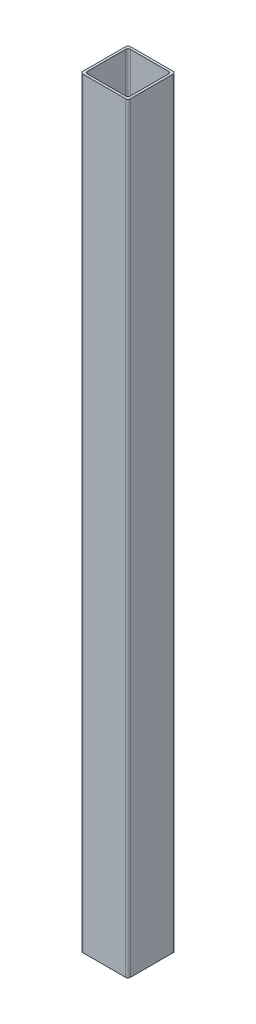
ISO-10303-21;
HEADER;
FILE_DESCRIPTION(('STEP AP214'),'2;1');
FILE_NAME('part.step','',(''),(''),'','','');
FILE_SCHEMA(('AUTOMOTIVE_DESIGN { 1 0 10303 214 1 1 1 1 }'));
ENDSEC;
DATA;
#1=APPLICATION_CONTEXT('core data for automotive mechanical design processes');
#2=APPLICATION_PROTOCOL_DEFINITION('international standard','automotive_design',2000,#1);
#3=PRODUCT_CONTEXT('',#1,'mechanical');
#4=PRODUCT('Part','Part','',(#3));
#5=PRODUCT_RELATED_PRODUCT_CATEGORY('part','',(#4));
#6=PRODUCT_DEFINITION_FORMATION('','',#4);
#7=PRODUCT_DEFINITION_CONTEXT('part definition',#1,'design');
#8=PRODUCT_DEFINITION('design','',#6,#7);
#9=PRODUCT_DEFINITION_SHAPE('','',#8);
#10=(LENGTH_UNIT() NAMED_UNIT(*) SI_UNIT(.MILLI.,.METRE.));
#11=(NAMED_UNIT(*) PLANE_ANGLE_UNIT() SI_UNIT($,.RADIAN.));
#12=(NAMED_UNIT(*) SI_UNIT($,.STERADIAN.) SOLID_ANGLE_UNIT());
#13=UNCERTAINTY_MEASURE_WITH_UNIT(LENGTH_MEASURE(1.E-05),#10,'distance_accuracy_value','');
#14=(GEOMETRIC_REPRESENTATION_CONTEXT(3) GLOBAL_UNCERTAINTY_ASSIGNED_CONTEXT((#13)) GLOBAL_UNIT_ASSIGNED_CONTEXT((#10,
#11,#12)) REPRESENTATION_CONTEXT('',''));
#15=CARTESIAN_POINT('',(0.,0.,0.));
#16=DIRECTION('',(0.,0.,1.));
#17=DIRECTION('',(1.,0.,0.));
#18=AXIS2_PLACEMENT_3D('',#15,#16,#17);
#19=CARTESIAN_POINT('',(18.,640.,-18.));
#20=DIRECTION('',(0.,1.,0.));
#21=DIRECTION('',(0.,0.,1.));
#22=AXIS2_PLACEMENT_3D('',#19,#20,#21);
#23=PLANE('',#22);
#24=CARTESIAN_POINT('',(18.,640.,-18.));
#25=DIRECTION('',(0.,1.,0.));
#26=DIRECTION('',(0.,0.,1.));
#27=AXIS2_PLACEMENT_3D('',#24,#25,#26);
#28=CIRCLE('',#27,2.);
#29=CARTESIAN_POINT('',(20.,640.,-18.));
#30=VERTEX_POINT('',#29);
#31=CARTESIAN_POINT('',(18.,640.,-20.));
#32=VERTEX_POINT('',#31);
#33=EDGE_CURVE('E213',#30,#32,#28,.T.);
#34=ORIENTED_EDGE('',*,*,#33,.T.);
#35=DIRECTION('',(-1.,0.,0.));
#36=VECTOR('',#35,1.);
#37=CARTESIAN_POINT('',(18.,640.,-20.));
#38=LINE('',#37,#36);
#39=CARTESIAN_POINT('',(-18.,640.,-20.));
#40=VERTEX_POINT('',#39);
#41=EDGE_CURVE('E216',#32,#40,#38,.T.);
#42=ORIENTED_EDGE('',*,*,#41,.T.);
#43=CARTESIAN_POINT('',(-18.,640.,-18.));
#44=DIRECTION('',(0.,1.,0.));
#45=DIRECTION('',(0.,0.,1.));
#46=AXIS2_PLACEMENT_3D('',#43,#44,#45);
#47=CIRCLE('',#46,2.);
#48=CARTESIAN_POINT('',(-20.,640.,-18.));
#49=VERTEX_POINT('',#48);
#50=EDGE_CURVE('E219',#40,#49,#47,.T.);
#51=ORIENTED_EDGE('',*,*,#50,.T.);
#52=DIRECTION('',(0.,0.,1.));
#53=VECTOR('',#52,1.);
#54=CARTESIAN_POINT('',(-20.,640.,18.));
#55=LINE('',#54,#53);
#56=CARTESIAN_POINT('',(-20.,640.,18.));
#57=VERTEX_POINT('',#56);
#58=EDGE_CURVE('E221',#49,#57,#55,.T.);
#59=ORIENTED_EDGE('',*,*,#58,.T.);
#60=CARTESIAN_POINT('',(-18.,640.,18.));
#61=DIRECTION('',(0.,1.,0.));
#62=DIRECTION('',(0.,0.,-1.));
#63=AXIS2_PLACEMENT_3D('',#60,#61,#62);
#64=CIRCLE('',#63,2.);
#65=CARTESIAN_POINT('',(-18.,640.,20.));
#66=VERTEX_POINT('',#65);
#67=EDGE_CURVE('E223',#57,#66,#64,.T.);
#68=ORIENTED_EDGE('',*,*,#67,.T.);
#69=DIRECTION('',(1.,0.,0.));
#70=VECTOR('',#69,1.);
#71=CARTESIAN_POINT('',(18.,640.,20.));
#72=LINE('',#71,#70);
#73=CARTESIAN_POINT('',(18.,640.,20.));
#74=VERTEX_POINT('',#73);
#75=EDGE_CURVE('E225',#66,#74,#72,.T.);
#76=ORIENTED_EDGE('',*,*,#75,.T.);
#77=CARTESIAN_POINT('',(18.,640.,18.));
#78=DIRECTION('',(0.,1.,0.));
#79=DIRECTION('',(0.,0.,1.));
#80=AXIS2_PLACEMENT_3D('',#77,#78,#79);
#81=CIRCLE('',#80,2.);
#82=CARTESIAN_POINT('',(20.,640.,18.));
#83=VERTEX_POINT('',#82);
#84=EDGE_CURVE('E227',#74,#83,#81,.T.);
#85=ORIENTED_EDGE('',*,*,#84,.T.);
#86=DIRECTION('',(0.,0.,-1.));
#87=VECTOR('',#86,1.);
#88=CARTESIAN_POINT('',(20.,640.,18.));
#89=LINE('',#88,#87);
#90=EDGE_CURVE('E229',#83,#30,#89,.T.);
#91=ORIENTED_EDGE('',*,*,#90,.T.);
#92=EDGE_LOOP('',(#34,#42,#51,#59,#68,#76,#85,#91));
#93=FACE_BOUND('',#92,.T.);
#94=DIRECTION('',(-1.,0.,0.));
#95=VECTOR('',#94,1.);
#96=CARTESIAN_POINT('',(16.,640.,-18.));
#97=LINE('',#96,#95);
#98=CARTESIAN_POINT('',(16.,640.,-18.));
#99=VERTEX_POINT('',#98);
#100=CARTESIAN_POINT('',(-16.,640.,-18.));
#101=VERTEX_POINT('',#100);
#102=EDGE_CURVE('E156',#99,#101,#97,.T.);
#103=ORIENTED_EDGE('',*,*,#102,.F.);
#104=CARTESIAN_POINT('',(16.,640.,-16.));
#105=DIRECTION('',(0.,1.,0.));
#106=DIRECTION('',(0.,0.,1.));
#107=AXIS2_PLACEMENT_3D('',#104,#105,#106);
#108=CIRCLE('',#107,2.);
#109=CARTESIAN_POINT('',(18.,640.,-16.));
#110=VERTEX_POINT('',#109);
#111=EDGE_CURVE('E148',#110,#99,#108,.T.);
#112=ORIENTED_EDGE('',*,*,#111,.F.);
#113=DIRECTION('',(0.,0.,-1.));
#114=VECTOR('',#113,1.);
#115=CARTESIAN_POINT('',(18.,640.,16.));
#116=LINE('',#115,#114);
#117=CARTESIAN_POINT('',(18.,640.,16.));
#118=VERTEX_POINT('',#117);
#119=EDGE_CURVE('E181',#118,#110,#116,.T.);
#120=ORIENTED_EDGE('',*,*,#119,.F.);
#121=CARTESIAN_POINT('',(16.,640.,16.));
#122=DIRECTION('',(0.,1.,0.));
#123=DIRECTION('',(0.,0.,1.));
#124=AXIS2_PLACEMENT_3D('',#121,#122,#123);
#125=CIRCLE('',#124,2.);
#126=CARTESIAN_POINT('',(16.,640.,18.));
#127=VERTEX_POINT('',#126);
#128=EDGE_CURVE('E179',#127,#118,#125,.T.);
#129=ORIENTED_EDGE('',*,*,#128,.F.);
#130=DIRECTION('',(1.,0.,0.));
#131=VECTOR('',#130,1.);
#132=CARTESIAN_POINT('',(16.,640.,18.));
#133=LINE('',#132,#131);
#134=CARTESIAN_POINT('',(-16.,640.,18.));
#135=VERTEX_POINT('',#134);
#136=EDGE_CURVE('E177',#135,#127,#133,.T.);
#137=ORIENTED_EDGE('',*,*,#136,.F.);
#138=CARTESIAN_POINT('',(-16.,640.,16.));
#139=DIRECTION('',(0.,1.,0.));
#140=DIRECTION('',(0.,0.,-1.));
#141=AXIS2_PLACEMENT_3D('',#138,#139,#140);
#142=CIRCLE('',#141,2.);
#143=CARTESIAN_POINT('',(-18.,640.,16.));
#144=VERTEX_POINT('',#143);
#145=EDGE_CURVE('E175',#144,#135,#142,.T.);
#146=ORIENTED_EDGE('',*,*,#145,.F.);
#147=DIRECTION('',(0.,0.,1.));
#148=VECTOR('',#147,1.);
#149=CARTESIAN_POINT('',(-18.,640.,16.));
#150=LINE('',#149,#148);
#151=CARTESIAN_POINT('',(-18.,640.,-16.));
#152=VERTEX_POINT('',#151);
#153=EDGE_CURVE('E171',#152,#144,#150,.T.);
#154=ORIENTED_EDGE('',*,*,#153,.F.);
#155=CARTESIAN_POINT('',(-16.,640.,-16.));
#156=DIRECTION('',(0.,1.,0.));
#157=DIRECTION('',(0.,0.,1.));
#158=AXIS2_PLACEMENT_3D('',#155,#156,#157);
#159=CIRCLE('',#158,2.);
#160=EDGE_CURVE('E169',#101,#152,#159,.T.);
#161=ORIENTED_EDGE('',*,*,#160,.F.);
#162=EDGE_LOOP('',(#103,#112,#120,#129,#137,#146,#154,#161));
#163=FACE_BOUND('',#162,.T.);
#164=ADVANCED_FACE('F35',(#93,#163),#23,.T.);
#165=CARTESIAN_POINT('',(18.,0.,-18.));
#166=DIRECTION('',(0.,1.,0.));
#167=DIRECTION('',(0.,0.,1.));
#168=AXIS2_PLACEMENT_3D('',#165,#166,#167);
#169=PLANE('',#168);
#170=CARTESIAN_POINT('',(18.,0.,-18.));
#171=DIRECTION('',(0.,1.,0.));
#172=DIRECTION('',(0.,0.,1.));
#173=AXIS2_PLACEMENT_3D('',#170,#171,#172);
#174=CIRCLE('',#173,2.);
#175=CARTESIAN_POINT('',(20.,0.,-18.));
#176=VERTEX_POINT('',#175);
#177=CARTESIAN_POINT('',(18.,0.,-20.));
#178=VERTEX_POINT('',#177);
#179=EDGE_CURVE('E164',#176,#178,#174,.T.);
#180=ORIENTED_EDGE('',*,*,#179,.F.);
#181=DIRECTION('',(0.,0.,-1.));
#182=VECTOR('',#181,1.);
#183=CARTESIAN_POINT('',(20.,0.,18.));
#184=LINE('',#183,#182);
#185=CARTESIAN_POINT('',(20.,0.,18.));
#186=VERTEX_POINT('',#185);
#187=EDGE_CURVE('E217',#186,#176,#184,.T.);
#188=ORIENTED_EDGE('',*,*,#187,.F.);
#189=CARTESIAN_POINT('',(18.,0.,18.));
#190=DIRECTION('',(0.,1.,0.));
#191=DIRECTION('',(0.,0.,1.));
#192=AXIS2_PLACEMENT_3D('',#189,#190,#191);
#193=CIRCLE('',#192,2.);
#194=CARTESIAN_POINT('',(18.,0.,20.));
#195=VERTEX_POINT('',#194);
#196=EDGE_CURVE('E244',#195,#186,#193,.T.);
#197=ORIENTED_EDGE('',*,*,#196,.F.);
#198=DIRECTION('',(1.,0.,0.));
#199=VECTOR('',#198,1.);
#200=CARTESIAN_POINT('',(18.,0.,20.));
#201=LINE('',#200,#199);
#202=CARTESIAN_POINT('',(-18.,0.,20.));
#203=VERTEX_POINT('',#202);
#204=EDGE_CURVE('E242',#203,#195,#201,.T.);
#205=ORIENTED_EDGE('',*,*,#204,.F.);
#206=CARTESIAN_POINT('',(-18.,0.,18.));
#207=DIRECTION('',(0.,1.,0.));
#208=DIRECTION('',(0.,0.,-1.));
#209=AXIS2_PLACEMENT_3D('',#206,#207,#208);
#210=CIRCLE('',#209,2.);
#211=CARTESIAN_POINT('',(-20.,0.,18.));
#212=VERTEX_POINT('',#211);
#213=EDGE_CURVE('E240',#212,#203,#210,.T.);
#214=ORIENTED_EDGE('',*,*,#213,.F.);
#215=DIRECTION('',(0.,0.,1.));
#216=VECTOR('',#215,1.);
#217=CARTESIAN_POINT('',(-20.,0.,18.));
#218=LINE('',#217,#216);
#219=CARTESIAN_POINT('',(-20.,0.,-18.));
#220=VERTEX_POINT('',#219);
#221=EDGE_CURVE('E238',#220,#212,#218,.T.);
#222=ORIENTED_EDGE('',*,*,#221,.F.);
#223=CARTESIAN_POINT('',(-18.,0.,-18.));
#224=DIRECTION('',(0.,1.,0.));
#225=DIRECTION('',(0.,0.,1.));
#226=AXIS2_PLACEMENT_3D('',#223,#224,#225);
#227=CIRCLE('',#226,2.);
#228=CARTESIAN_POINT('',(-18.,0.,-20.));
#229=VERTEX_POINT('',#228);
#230=EDGE_CURVE('E236',#229,#220,#227,.T.);
#231=ORIENTED_EDGE('',*,*,#230,.F.);
#232=DIRECTION('',(-1.,0.,0.));
#233=VECTOR('',#232,1.);
#234=CARTESIAN_POINT('',(18.,0.,-20.));
#235=LINE('',#234,#233);
#236=EDGE_CURVE('E234',#178,#229,#235,.T.);
#237=ORIENTED_EDGE('',*,*,#236,.F.);
#238=EDGE_LOOP('',(#180,#188,#197,#205,#214,#222,#231,#237));
#239=FACE_BOUND('',#238,.T.);
#240=CARTESIAN_POINT('',(16.,0.,-16.));
#241=DIRECTION('',(0.,1.,0.));
#242=DIRECTION('',(0.,0.,1.));
#243=AXIS2_PLACEMENT_3D('',#240,#241,#242);
#244=CIRCLE('',#243,2.);
#245=CARTESIAN_POINT('',(18.,0.,-16.));
#246=VERTEX_POINT('',#245);
#247=CARTESIAN_POINT('',(16.,0.,-18.));
#248=VERTEX_POINT('',#247);
#249=EDGE_CURVE('E58',#246,#248,#244,.T.);
#250=ORIENTED_EDGE('',*,*,#249,.T.);
#251=DIRECTION('',(-1.,0.,0.));
#252=VECTOR('',#251,1.);
#253=CARTESIAN_POINT('',(16.,0.,-18.));
#254=LINE('',#253,#252);
#255=CARTESIAN_POINT('',(-16.,0.,-18.));
#256=VERTEX_POINT('',#255);
#257=EDGE_CURVE('E163',#248,#256,#254,.T.);
#258=ORIENTED_EDGE('',*,*,#257,.T.);
#259=CARTESIAN_POINT('',(-16.,0.,-16.));
#260=DIRECTION('',(0.,1.,0.));
#261=DIRECTION('',(0.,0.,1.));
#262=AXIS2_PLACEMENT_3D('',#259,#260,#261);
#263=CIRCLE('',#262,2.);
#264=CARTESIAN_POINT('',(-18.,0.,-16.));
#265=VERTEX_POINT('',#264);
#266=EDGE_CURVE('E185',#256,#265,#263,.T.);
#267=ORIENTED_EDGE('',*,*,#266,.T.);
#268=DIRECTION('',(0.,0.,1.));
#269=VECTOR('',#268,1.);
#270=CARTESIAN_POINT('',(-18.,0.,16.));
#271=LINE('',#270,#269);
#272=CARTESIAN_POINT('',(-18.,0.,16.));
#273=VERTEX_POINT('',#272);
#274=EDGE_CURVE('E188',#265,#273,#271,.T.);
#275=ORIENTED_EDGE('',*,*,#274,.T.);
#276=CARTESIAN_POINT('',(-16.,0.,16.));
#277=DIRECTION('',(0.,1.,0.));
#278=DIRECTION('',(0.,0.,-1.));
#279=AXIS2_PLACEMENT_3D('',#276,#277,#278);
#280=CIRCLE('',#279,2.);
#281=CARTESIAN_POINT('',(-16.,0.,18.));
#282=VERTEX_POINT('',#281);
#283=EDGE_CURVE('E191',#273,#282,#280,.T.);
#284=ORIENTED_EDGE('',*,*,#283,.T.);
#285=DIRECTION('',(1.,0.,0.));
#286=VECTOR('',#285,1.);
#287=CARTESIAN_POINT('',(16.,0.,18.));
#288=LINE('',#287,#286);
#289=CARTESIAN_POINT('',(16.,0.,18.));
#290=VERTEX_POINT('',#289);
#291=EDGE_CURVE('E194',#282,#290,#288,.T.);
#292=ORIENTED_EDGE('',*,*,#291,.T.);
#293=CARTESIAN_POINT('',(16.,0.,16.));
#294=DIRECTION('',(0.,1.,0.));
#295=DIRECTION('',(0.,0.,1.));
#296=AXIS2_PLACEMENT_3D('',#293,#294,#295);
#297=CIRCLE('',#296,2.);
#298=CARTESIAN_POINT('',(18.,0.,16.));
#299=VERTEX_POINT('',#298);
#300=EDGE_CURVE('E197',#290,#299,#297,.T.);
#301=ORIENTED_EDGE('',*,*,#300,.T.);
#302=DIRECTION('',(0.,0.,-1.));
#303=VECTOR('',#302,1.);
#304=CARTESIAN_POINT('',(18.,0.,16.));
#305=LINE('',#304,#303);
#306=EDGE_CURVE('E157',#299,#246,#305,.T.);
#307=ORIENTED_EDGE('',*,*,#306,.T.);
#308=EDGE_LOOP('',(#250,#258,#267,#275,#284,#292,#301,#307));
#309=FACE_BOUND('',#308,.T.);
#310=ADVANCED_FACE('F274',(#239,#309),#169,.F.);
#311=CARTESIAN_POINT('',(18.,640.,-18.));
#312=DIRECTION('',(0.,-1.,0.));
#313=DIRECTION('',(0.,0.,-1.));
#314=AXIS2_PLACEMENT_3D('',#311,#312,#313);
#315=CYLINDRICAL_SURFACE('',#314,2.);
#316=ORIENTED_EDGE('',*,*,#179,.T.);
#317=DIRECTION('',(0.,-1.,0.));
#318=VECTOR('',#317,1.);
#319=CARTESIAN_POINT('',(18.,640.,-20.));
#320=LINE('',#319,#318);
#321=EDGE_CURVE('E11',#32,#178,#320,.T.);
#322=ORIENTED_EDGE('',*,*,#321,.F.);
#323=ORIENTED_EDGE('',*,*,#33,.F.);
#324=DIRECTION('',(0.,-1.,0.));
#325=VECTOR('',#324,1.);
#326=CARTESIAN_POINT('',(20.,640.,-18.));
#327=LINE('',#326,#325);
#328=EDGE_CURVE('E231',#30,#176,#327,.T.);
#329=ORIENTED_EDGE('',*,*,#328,.T.);
#330=EDGE_LOOP('',(#316,#322,#323,#329));
#331=FACE_BOUND('',#330,.T.);
#332=ADVANCED_FACE('F37',(#331),#315,.T.);
#333=CARTESIAN_POINT('',(18.,640.,-20.));
#334=DIRECTION('',(0.,0.,1.));
#335=DIRECTION('',(1.,0.,0.));
#336=AXIS2_PLACEMENT_3D('',#333,#334,#335);
#337=PLANE('',#336);
#338=ORIENTED_EDGE('',*,*,#236,.T.);
#339=DIRECTION('',(0.,-1.,0.));
#340=VECTOR('',#339,1.);
#341=CARTESIAN_POINT('',(-18.,640.,-20.));
#342=LINE('',#341,#340);
#343=EDGE_CURVE('E43',#40,#229,#342,.T.);
#344=ORIENTED_EDGE('',*,*,#343,.F.);
#345=ORIENTED_EDGE('',*,*,#41,.F.);
#346=ORIENTED_EDGE('',*,*,#321,.T.);
#347=EDGE_LOOP('',(#338,#344,#345,#346));
#348=FACE_BOUND('',#347,.T.);
#349=ADVANCED_FACE('F291',(#348),#337,.F.);
#350=CARTESIAN_POINT('',(-18.,640.,-18.));
#351=DIRECTION('',(0.,-1.,0.));
#352=DIRECTION('',(0.,0.,-1.));
#353=AXIS2_PLACEMENT_3D('',#350,#351,#352);
#354=CYLINDRICAL_SURFACE('',#353,2.);
#355=ORIENTED_EDGE('',*,*,#230,.T.);
#356=DIRECTION('',(0.,-1.,0.));
#357=VECTOR('',#356,1.);
#358=CARTESIAN_POINT('',(-20.,640.,-18.));
#359=LINE('',#358,#357);
#360=EDGE_CURVE('E261',#49,#220,#359,.T.);
#361=ORIENTED_EDGE('',*,*,#360,.F.);
#362=ORIENTED_EDGE('',*,*,#50,.F.);
#363=ORIENTED_EDGE('',*,*,#343,.T.);
#364=EDGE_LOOP('',(#355,#361,#362,#363));
#365=FACE_BOUND('',#364,.T.);
#366=ADVANCED_FACE('F268',(#365),#354,.T.);
#367=CARTESIAN_POINT('',(-20.,640.,18.));
#368=DIRECTION('',(1.,0.,0.));
#369=DIRECTION('',(0.,0.,-1.));
#370=AXIS2_PLACEMENT_3D('',#367,#368,#369);
#371=PLANE('',#370);
#372=ORIENTED_EDGE('',*,*,#221,.T.);
#373=DIRECTION('',(0.,-1.,0.));
#374=VECTOR('',#373,1.);
#375=CARTESIAN_POINT('',(-20.,640.,18.));
#376=LINE('',#375,#374);
#377=EDGE_CURVE('E258',#57,#212,#376,.T.);
#378=ORIENTED_EDGE('',*,*,#377,.F.);
#379=ORIENTED_EDGE('',*,*,#58,.F.);
#380=ORIENTED_EDGE('',*,*,#360,.T.);
#381=EDGE_LOOP('',(#372,#378,#379,#380));
#382=FACE_BOUND('',#381,.T.);
#383=ADVANCED_FACE('F280',(#382),#371,.F.);
#384=CARTESIAN_POINT('',(-18.,640.,18.));
#385=DIRECTION('',(0.,-1.,0.));
#386=DIRECTION('',(0.,0.,-1.));
#387=AXIS2_PLACEMENT_3D('',#384,#385,#386);
#388=CYLINDRICAL_SURFACE('',#387,2.);
#389=ORIENTED_EDGE('',*,*,#213,.T.);
#390=DIRECTION('',(0.,-1.,0.));
#391=VECTOR('',#390,1.);
#392=CARTESIAN_POINT('',(-18.,640.,20.));
#393=LINE('',#392,#391);
#394=EDGE_CURVE('E255',#66,#203,#393,.T.);
#395=ORIENTED_EDGE('',*,*,#394,.F.);
#396=ORIENTED_EDGE('',*,*,#67,.F.);
#397=ORIENTED_EDGE('',*,*,#377,.T.);
#398=EDGE_LOOP('',(#389,#395,#396,#397));
#399=FACE_BOUND('',#398,.T.);
#400=ADVANCED_FACE('F284',(#399),#388,.T.);
#401=CARTESIAN_POINT('',(18.,640.,20.));
#402=DIRECTION('',(0.,0.,-1.));
#403=DIRECTION('',(-1.,0.,0.));
#404=AXIS2_PLACEMENT_3D('',#401,#402,#403);
#405=PLANE('',#404);
#406=ORIENTED_EDGE('',*,*,#204,.T.);
#407=DIRECTION('',(0.,-1.,0.));
#408=VECTOR('',#407,1.);
#409=CARTESIAN_POINT('',(18.,640.,20.));
#410=LINE('',#409,#408);
#411=EDGE_CURVE('E252',#74,#195,#410,.T.);
#412=ORIENTED_EDGE('',*,*,#411,.F.);
#413=ORIENTED_EDGE('',*,*,#75,.F.);
#414=ORIENTED_EDGE('',*,*,#394,.T.);
#415=EDGE_LOOP('',(#406,#412,#413,#414));
#416=FACE_BOUND('',#415,.T.);
#417=ADVANCED_FACE('F304',(#416),#405,.F.);
#418=CARTESIAN_POINT('',(18.,640.,18.));
#419=DIRECTION('',(0.,-1.,0.));
#420=DIRECTION('',(0.,0.,-1.));
#421=AXIS2_PLACEMENT_3D('',#418,#419,#420);
#422=CYLINDRICAL_SURFACE('',#421,2.);
#423=ORIENTED_EDGE('',*,*,#196,.T.);
#424=DIRECTION('',(0.,-1.,0.));
#425=VECTOR('',#424,1.);
#426=CARTESIAN_POINT('',(20.,640.,18.));
#427=LINE('',#426,#425);
#428=EDGE_CURVE('E249',#83,#186,#427,.T.);
#429=ORIENTED_EDGE('',*,*,#428,.F.);
#430=ORIENTED_EDGE('',*,*,#84,.F.);
#431=ORIENTED_EDGE('',*,*,#411,.T.);
#432=EDGE_LOOP('',(#423,#429,#430,#431));
#433=FACE_BOUND('',#432,.T.);
#434=ADVANCED_FACE('F302',(#433),#422,.T.);
#435=CARTESIAN_POINT('',(20.,640.,18.));
#436=DIRECTION('',(-1.,0.,0.));
#437=DIRECTION('',(0.,0.,1.));
#438=AXIS2_PLACEMENT_3D('',#435,#436,#437);
#439=PLANE('',#438);
#440=ORIENTED_EDGE('',*,*,#187,.T.);
#441=ORIENTED_EDGE('',*,*,#328,.F.);
#442=ORIENTED_EDGE('',*,*,#90,.F.);
#443=ORIENTED_EDGE('',*,*,#428,.T.);
#444=EDGE_LOOP('',(#440,#441,#442,#443));
#445=FACE_BOUND('',#444,.T.);
#446=ADVANCED_FACE('F297',(#445),#439,.F.);
#447=CARTESIAN_POINT('',(16.,640.,-16.));
#448=DIRECTION('',(0.,-1.,0.));
#449=DIRECTION('',(0.,0.,-1.));
#450=AXIS2_PLACEMENT_3D('',#447,#448,#449);
#451=CYLINDRICAL_SURFACE('',#450,2.);
#452=ORIENTED_EDGE('',*,*,#249,.F.);
#453=DIRECTION('',(0.,-1.,0.));
#454=VECTOR('',#453,1.);
#455=CARTESIAN_POINT('',(18.,640.,-16.));
#456=LINE('',#455,#454);
#457=EDGE_CURVE('E152',#110,#246,#456,.T.);
#458=ORIENTED_EDGE('',*,*,#457,.F.);
#459=ORIENTED_EDGE('',*,*,#111,.T.);
#460=DIRECTION('',(0.,-1.,0.));
#461=VECTOR('',#460,1.);
#462=CARTESIAN_POINT('',(16.,640.,-18.));
#463=LINE('',#462,#461);
#464=EDGE_CURVE('E151',#99,#248,#463,.T.);
#465=ORIENTED_EDGE('',*,*,#464,.T.);
#466=EDGE_LOOP('',(#452,#458,#459,#465));
#467=FACE_BOUND('',#466,.T.);
#468=ADVANCED_FACE('F150',(#467),#451,.F.);
#469=CARTESIAN_POINT('',(16.,640.,-18.));
#470=DIRECTION('',(0.,0.,1.));
#471=DIRECTION('',(1.,0.,0.));
#472=AXIS2_PLACEMENT_3D('',#469,#470,#471);
#473=PLANE('',#472);
#474=ORIENTED_EDGE('',*,*,#257,.F.);
#475=ORIENTED_EDGE('',*,*,#464,.F.);
#476=ORIENTED_EDGE('',*,*,#102,.T.);
#477=DIRECTION('',(0.,-1.,0.));
#478=VECTOR('',#477,1.);
#479=CARTESIAN_POINT('',(-16.,640.,-18.));
#480=LINE('',#479,#478);
#481=EDGE_CURVE('E165',#101,#256,#480,.T.);
#482=ORIENTED_EDGE('',*,*,#481,.T.);
#483=EDGE_LOOP('',(#474,#475,#476,#482));
#484=FACE_BOUND('',#483,.T.);
#485=ADVANCED_FACE('F160',(#484),#473,.T.);
#486=CARTESIAN_POINT('',(-16.,640.,-16.));
#487=DIRECTION('',(0.,-1.,0.));
#488=DIRECTION('',(0.,0.,-1.));
#489=AXIS2_PLACEMENT_3D('',#486,#487,#488);
#490=CYLINDRICAL_SURFACE('',#489,2.);
#491=ORIENTED_EDGE('',*,*,#266,.F.);
#492=ORIENTED_EDGE('',*,*,#481,.F.);
#493=ORIENTED_EDGE('',*,*,#160,.T.);
#494=DIRECTION('',(0.,-1.,0.));
#495=VECTOR('',#494,1.);
#496=CARTESIAN_POINT('',(-18.,640.,-16.));
#497=LINE('',#496,#495);
#498=EDGE_CURVE('E210',#152,#265,#497,.T.);
#499=ORIENTED_EDGE('',*,*,#498,.T.);
#500=EDGE_LOOP('',(#491,#492,#493,#499));
#501=FACE_BOUND('',#500,.T.);
#502=ADVANCED_FACE('F329',(#501),#490,.F.);
#503=CARTESIAN_POINT('',(-18.,640.,16.));
#504=DIRECTION('',(1.,0.,0.));
#505=DIRECTION('',(0.,0.,-1.));
#506=AXIS2_PLACEMENT_3D('',#503,#504,#505);
#507=PLANE('',#506);
#508=ORIENTED_EDGE('',*,*,#274,.F.);
#509=ORIENTED_EDGE('',*,*,#498,.F.);
#510=ORIENTED_EDGE('',*,*,#153,.T.);
#511=DIRECTION('',(0.,-1.,0.));
#512=VECTOR('',#511,1.);
#513=CARTESIAN_POINT('',(-18.,640.,16.));
#514=LINE('',#513,#512);
#515=EDGE_CURVE('E208',#144,#273,#514,.T.);
#516=ORIENTED_EDGE('',*,*,#515,.T.);
#517=EDGE_LOOP('',(#508,#509,#510,#516));
#518=FACE_BOUND('',#517,.T.);
#519=ADVANCED_FACE('F333',(#518),#507,.T.);
#520=CARTESIAN_POINT('',(-16.,640.,16.));
#521=DIRECTION('',(0.,-1.,0.));
#522=DIRECTION('',(0.,0.,-1.));
#523=AXIS2_PLACEMENT_3D('',#520,#521,#522);
#524=CYLINDRICAL_SURFACE('',#523,2.);
#525=ORIENTED_EDGE('',*,*,#283,.F.);
#526=ORIENTED_EDGE('',*,*,#515,.F.);
#527=ORIENTED_EDGE('',*,*,#145,.T.);
#528=DIRECTION('',(0.,-1.,0.));
#529=VECTOR('',#528,1.);
#530=CARTESIAN_POINT('',(-16.,640.,18.));
#531=LINE('',#530,#529);
#532=EDGE_CURVE('E206',#135,#282,#531,.T.);
#533=ORIENTED_EDGE('',*,*,#532,.T.);
#534=EDGE_LOOP('',(#525,#526,#527,#533));
#535=FACE_BOUND('',#534,.T.);
#536=ADVANCED_FACE('F339',(#535),#524,.F.);
#537=CARTESIAN_POINT('',(16.,640.,18.));
#538=DIRECTION('',(0.,0.,-1.));
#539=DIRECTION('',(-1.,0.,0.));
#540=AXIS2_PLACEMENT_3D('',#537,#538,#539);
#541=PLANE('',#540);
#542=ORIENTED_EDGE('',*,*,#291,.F.);
#543=ORIENTED_EDGE('',*,*,#532,.F.);
#544=ORIENTED_EDGE('',*,*,#136,.T.);
#545=DIRECTION('',(0.,-1.,0.));
#546=VECTOR('',#545,1.);
#547=CARTESIAN_POINT('',(16.,640.,18.));
#548=LINE('',#547,#546);
#549=EDGE_CURVE('E204',#127,#290,#548,.T.);
#550=ORIENTED_EDGE('',*,*,#549,.T.);
#551=EDGE_LOOP('',(#542,#543,#544,#550));
#552=FACE_BOUND('',#551,.T.);
#553=ADVANCED_FACE('F343',(#552),#541,.T.);
#554=CARTESIAN_POINT('',(16.,640.,16.));
#555=DIRECTION('',(0.,-1.,0.));
#556=DIRECTION('',(0.,0.,-1.));
#557=AXIS2_PLACEMENT_3D('',#554,#555,#556);
#558=CYLINDRICAL_SURFACE('',#557,2.);
#559=ORIENTED_EDGE('',*,*,#300,.F.);
#560=ORIENTED_EDGE('',*,*,#549,.F.);
#561=ORIENTED_EDGE('',*,*,#128,.T.);
#562=DIRECTION('',(0.,-1.,0.));
#563=VECTOR('',#562,1.);
#564=CARTESIAN_POINT('',(18.,640.,16.));
#565=LINE('',#564,#563);
#566=EDGE_CURVE('E50',#118,#299,#565,.T.);
#567=ORIENTED_EDGE('',*,*,#566,.T.);
#568=EDGE_LOOP('',(#559,#560,#561,#567));
#569=FACE_BOUND('',#568,.T.);
#570=ADVANCED_FACE('F347',(#569),#558,.F.);
#571=CARTESIAN_POINT('',(18.,640.,16.));
#572=DIRECTION('',(-1.,0.,0.));
#573=DIRECTION('',(0.,0.,1.));
#574=AXIS2_PLACEMENT_3D('',#571,#572,#573);
#575=PLANE('',#574);
#576=ORIENTED_EDGE('',*,*,#306,.F.);
#577=ORIENTED_EDGE('',*,*,#566,.F.);
#578=ORIENTED_EDGE('',*,*,#119,.T.);
#579=ORIENTED_EDGE('',*,*,#457,.T.);
#580=EDGE_LOOP('',(#576,#577,#578,#579));
#581=FACE_BOUND('',#580,.T.);
#582=ADVANCED_FACE('F351',(#581),#575,.T.);
#583=CLOSED_SHELL('',(#164,#310,#332,#349,#366,#383,#400,#417,#434,#446,#468,#485,#502,#519,
#536,#553,#570,#582));
#584=MANIFOLD_SOLID_BREP('B2',#583);
#585=ADVANCED_BREP_SHAPE_REPRESENTATION('',(#18,#584),#14);
#586=SHAPE_DEFINITION_REPRESENTATION(#9,#585);
ENDSEC;
END-ISO-10303-21;
